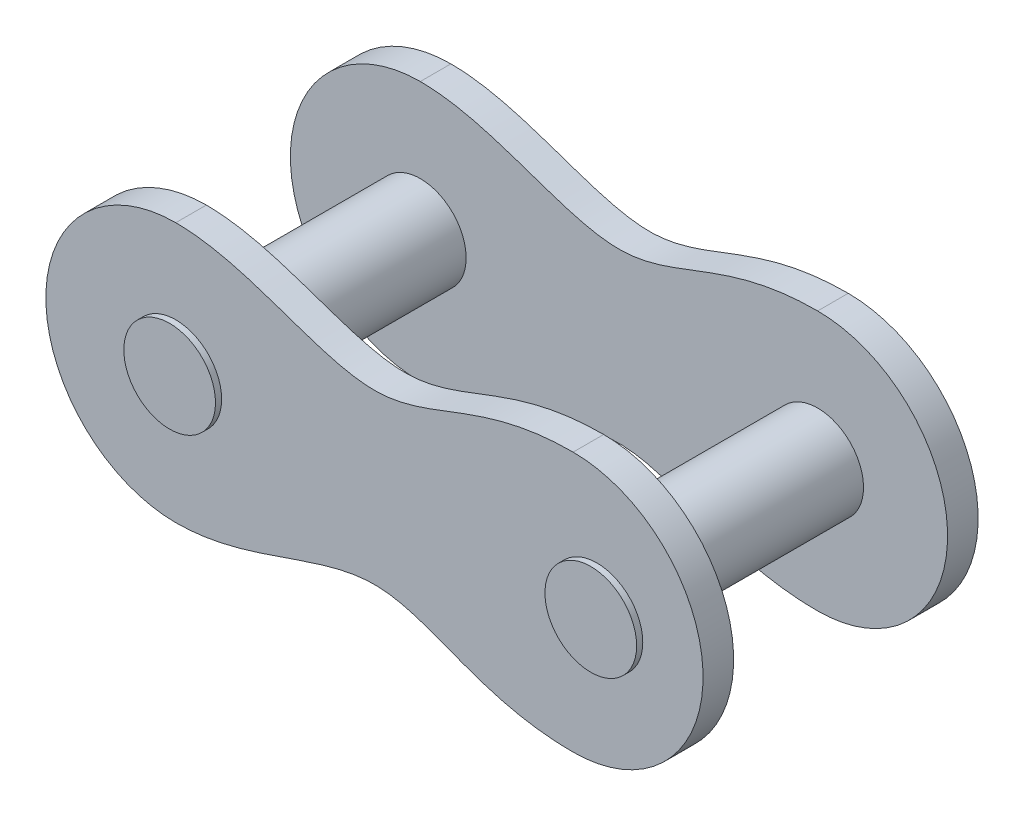
ISO-10303-21;
HEADER;
FILE_DESCRIPTION(('STEP AP214'),'2;1');
FILE_NAME('part.step','',(''),(''),'','','');
FILE_SCHEMA(('AUTOMOTIVE_DESIGN { 1 0 10303 214 1 1 1 1 }'));
ENDSEC;
DATA;
#1=APPLICATION_CONTEXT('core data for automotive mechanical design processes');
#2=APPLICATION_PROTOCOL_DEFINITION('international standard','automotive_design',2000,#1);
#3=PRODUCT_CONTEXT('',#1,'mechanical');
#4=PRODUCT('Part','Part','',(#3));
#5=PRODUCT_RELATED_PRODUCT_CATEGORY('part','',(#4));
#6=PRODUCT_DEFINITION_FORMATION('','',#4);
#7=PRODUCT_DEFINITION_CONTEXT('part definition',#1,'design');
#8=PRODUCT_DEFINITION('design','',#6,#7);
#9=PRODUCT_DEFINITION_SHAPE('','',#8);
#10=(LENGTH_UNIT() NAMED_UNIT(*) SI_UNIT(.MILLI.,.METRE.));
#11=(NAMED_UNIT(*) PLANE_ANGLE_UNIT() SI_UNIT($,.RADIAN.));
#12=(NAMED_UNIT(*) SI_UNIT($,.STERADIAN.) SOLID_ANGLE_UNIT());
#13=UNCERTAINTY_MEASURE_WITH_UNIT(LENGTH_MEASURE(1.E-05),#10,'distance_accuracy_value','');
#14=(GEOMETRIC_REPRESENTATION_CONTEXT(3) GLOBAL_UNCERTAINTY_ASSIGNED_CONTEXT((#13)) GLOBAL_UNIT_ASSIGNED_CONTEXT((#10,
#11,#12)) REPRESENTATION_CONTEXT('',''));
#15=CARTESIAN_POINT('',(0.,0.,0.));
#16=DIRECTION('',(0.,0.,1.));
#17=DIRECTION('',(1.,0.,0.));
#18=AXIS2_PLACEMENT_3D('',#15,#16,#17);
#19=CARTESIAN_POINT('',(0.,0.,9.));
#20=DIRECTION('',(0.,0.,-1.));
#21=DIRECTION('',(-1.,0.,0.));
#22=AXIS2_PLACEMENT_3D('',#19,#20,#21);
#23=CYLINDRICAL_SURFACE('',#22,1.5);
#24=CARTESIAN_POINT('',(0.,0.,2.));
#25=DIRECTION('',(0.,0.,1.));
#26=DIRECTION('',(0.,-1.,0.));
#27=AXIS2_PLACEMENT_3D('',#24,#25,#26);
#28=CIRCLE('',#27,1.5);
#29=CARTESIAN_POINT('',(0.,-1.5,2.));
#30=VERTEX_POINT('',#29);
#31=EDGE_CURVE('E122',#30,#30,#28,.T.);
#32=ORIENTED_EDGE('',*,*,#31,.T.);
#33=EDGE_LOOP('',(#32));
#34=FACE_BOUND('',#33,.T.);
#35=CARTESIAN_POINT('',(0.,0.,9.));
#36=DIRECTION('',(0.,0.,1.));
#37=DIRECTION('',(1.,0.,0.));
#38=AXIS2_PLACEMENT_3D('',#35,#36,#37);
#39=CIRCLE('',#38,1.5);
#40=CARTESIAN_POINT('',(1.5,0.,9.));
#41=VERTEX_POINT('',#40);
#42=EDGE_CURVE('E237',#41,#41,#39,.T.);
#43=ORIENTED_EDGE('',*,*,#42,.F.);
#44=EDGE_LOOP('',(#43));
#45=FACE_BOUND('',#44,.T.);
#46=ADVANCED_FACE('F36',(#34,#45),#23,.T.);
#47=CARTESIAN_POINT('',(13.,4.25,10.));
#48=CARTESIAN_POINT('',(9.8864097179551,4.25,10.));
#49=CARTESIAN_POINT('',(6.86364338574942,1.25,10.));
#50=CARTESIAN_POINT('',(2.38630351054606,4.25,10.));
#51=CARTESIAN_POINT('',(0.,4.25,10.));
#52=B_SPLINE_CURVE_WITH_KNOTS('',3,(#47,#48,#49,#50,#51),.UNSPECIFIED.,.F.,.F.,(4,1,4),(0.,0.5,
1.),.UNSPECIFIED.);
#53=DIRECTION('',(0.,0.,-1.));
#54=VECTOR('',#53,1.);
#55=SURFACE_OF_LINEAR_EXTRUSION('',#52,#54);
#56=CARTESIAN_POINT('',(13.,4.25,9.));
#57=CARTESIAN_POINT('',(9.8864097179551,4.25,9.));
#58=CARTESIAN_POINT('',(6.86364338574942,1.25,9.));
#59=CARTESIAN_POINT('',(2.38630351054606,4.25,9.));
#60=CARTESIAN_POINT('',(0.,4.25,9.));
#61=B_SPLINE_CURVE_WITH_KNOTS('',3,(#56,#57,#58,#59,#60),.UNSPECIFIED.,.F.,.F.,(4,1,4),(0.,0.5,
1.),.UNSPECIFIED.);
#62=CARTESIAN_POINT('',(13.,4.25,9.));
#63=VERTEX_POINT('',#62);
#64=CARTESIAN_POINT('',(0.,4.25,9.));
#65=VERTEX_POINT('',#64);
#66=EDGE_CURVE('E211',#63,#65,#61,.T.);
#67=ORIENTED_EDGE('',*,*,#66,.T.);
#68=DIRECTION('',(0.,0.,-1.));
#69=VECTOR('',#68,1.);
#70=CARTESIAN_POINT('',(0.,4.25,10.));
#71=LINE('',#70,#69);
#72=CARTESIAN_POINT('',(0.,4.25,10.));
#73=VERTEX_POINT('',#72);
#74=EDGE_CURVE('E235',#73,#65,#71,.T.);
#75=ORIENTED_EDGE('',*,*,#74,.F.);
#76=CARTESIAN_POINT('',(13.,4.25,10.));
#77=VERTEX_POINT('',#76);
#78=EDGE_CURVE('E229',#77,#73,#52,.T.);
#79=ORIENTED_EDGE('',*,*,#78,.F.);
#80=DIRECTION('',(0.,0.,-1.));
#81=VECTOR('',#80,1.);
#82=CARTESIAN_POINT('',(13.,4.25,10.));
#83=LINE('',#82,#81);
#84=EDGE_CURVE('E210',#77,#63,#83,.T.);
#85=ORIENTED_EDGE('',*,*,#84,.T.);
#86=EDGE_LOOP('',(#67,#75,#79,#85));
#87=FACE_BOUND('',#86,.T.);
#88=ADVANCED_FACE('F264',(#87),#55,.F.);
#89=CARTESIAN_POINT('',(0.,0.,10.));
#90=DIRECTION('',(0.,0.,-1.));
#91=DIRECTION('',(-1.,0.,0.));
#92=AXIS2_PLACEMENT_3D('',#89,#90,#91);
#93=CYLINDRICAL_SURFACE('',#92,4.25);
#94=CARTESIAN_POINT('',(0.,0.,9.));
#95=DIRECTION('',(0.,0.,1.));
#96=DIRECTION('',(1.,0.,0.));
#97=AXIS2_PLACEMENT_3D('',#94,#95,#96);
#98=CIRCLE('',#97,4.25);
#99=CARTESIAN_POINT('',(0.,-4.25,9.));
#100=VERTEX_POINT('',#99);
#101=EDGE_CURVE('E216',#65,#100,#98,.T.);
#102=ORIENTED_EDGE('',*,*,#101,.T.);
#103=DIRECTION('',(0.,0.,-1.));
#104=VECTOR('',#103,1.);
#105=CARTESIAN_POINT('',(0.,-4.25,10.));
#106=LINE('',#105,#104);
#107=CARTESIAN_POINT('',(0.,-4.25,10.));
#108=VERTEX_POINT('',#107);
#109=EDGE_CURVE('E233',#108,#100,#106,.T.);
#110=ORIENTED_EDGE('',*,*,#109,.F.);
#111=CARTESIAN_POINT('',(0.,0.,10.));
#112=DIRECTION('',(0.,0.,1.));
#113=DIRECTION('',(1.,0.,0.));
#114=AXIS2_PLACEMENT_3D('',#111,#112,#113);
#115=CIRCLE('',#114,4.25);
#116=EDGE_CURVE('E84',#73,#108,#115,.T.);
#117=ORIENTED_EDGE('',*,*,#116,.F.);
#118=ORIENTED_EDGE('',*,*,#74,.T.);
#119=EDGE_LOOP('',(#102,#110,#117,#118));
#120=FACE_BOUND('',#119,.T.);
#121=ADVANCED_FACE('F198',(#120),#93,.T.);
#122=CARTESIAN_POINT('',(0.,-4.25,10.));
#123=CARTESIAN_POINT('',(2.38630351054606,-4.25,10.));
#124=CARTESIAN_POINT('',(6.86364338574942,-1.25,10.));
#125=CARTESIAN_POINT('',(9.8864097179551,-4.25,10.));
#126=CARTESIAN_POINT('',(13.,-4.25,10.));
#127=B_SPLINE_CURVE_WITH_KNOTS('',3,(#122,#123,#124,#125,#126),.UNSPECIFIED.,.F.,.F.,(4,1,4),
(0.,0.5,1.),.UNSPECIFIED.);
#128=DIRECTION('',(0.,0.,-1.));
#129=VECTOR('',#128,1.);
#130=SURFACE_OF_LINEAR_EXTRUSION('',#127,#129);
#131=CARTESIAN_POINT('',(0.,-4.25,9.));
#132=CARTESIAN_POINT('',(2.38630351054606,-4.25,9.));
#133=CARTESIAN_POINT('',(6.86364338574942,-1.25,9.));
#134=CARTESIAN_POINT('',(9.8864097179551,-4.25,9.));
#135=CARTESIAN_POINT('',(13.,-4.25,9.));
#136=B_SPLINE_CURVE_WITH_KNOTS('',3,(#131,#132,#133,#134,#135),.UNSPECIFIED.,.F.,.F.,(4,1,4),
(0.,0.5,1.),.UNSPECIFIED.);
#137=CARTESIAN_POINT('',(13.,-4.25,9.));
#138=VERTEX_POINT('',#137);
#139=EDGE_CURVE('E70',#100,#138,#136,.T.);
#140=ORIENTED_EDGE('',*,*,#139,.T.);
#141=DIRECTION('',(0.,0.,-1.));
#142=VECTOR('',#141,1.);
#143=CARTESIAN_POINT('',(13.,-4.25,10.));
#144=LINE('',#143,#142);
#145=CARTESIAN_POINT('',(13.,-4.25,10.));
#146=VERTEX_POINT('',#145);
#147=EDGE_CURVE('E231',#146,#138,#144,.T.);
#148=ORIENTED_EDGE('',*,*,#147,.F.);
#149=EDGE_CURVE('E199',#108,#146,#127,.T.);
#150=ORIENTED_EDGE('',*,*,#149,.F.);
#151=ORIENTED_EDGE('',*,*,#109,.T.);
#152=EDGE_LOOP('',(#140,#148,#150,#151));
#153=FACE_BOUND('',#152,.T.);
#154=ADVANCED_FACE('F194',(#153),#130,.F.);
#155=CARTESIAN_POINT('',(13.,0.,10.));
#156=DIRECTION('',(0.,0.,-1.));
#157=DIRECTION('',(-1.,0.,0.));
#158=AXIS2_PLACEMENT_3D('',#155,#156,#157);
#159=CYLINDRICAL_SURFACE('',#158,4.25);
#160=CARTESIAN_POINT('',(13.,0.,9.));
#161=DIRECTION('',(0.,0.,1.));
#162=DIRECTION('',(1.,0.,0.));
#163=AXIS2_PLACEMENT_3D('',#160,#161,#162);
#164=CIRCLE('',#163,4.25);
#165=EDGE_CURVE('E76',#138,#63,#164,.T.);
#166=ORIENTED_EDGE('',*,*,#165,.T.);
#167=ORIENTED_EDGE('',*,*,#84,.F.);
#168=CARTESIAN_POINT('',(13.,0.,10.));
#169=DIRECTION('',(0.,0.,1.));
#170=DIRECTION('',(1.,0.,0.));
#171=AXIS2_PLACEMENT_3D('',#168,#169,#170);
#172=CIRCLE('',#171,4.25);
#173=EDGE_CURVE('E52',#146,#77,#172,.T.);
#174=ORIENTED_EDGE('',*,*,#173,.F.);
#175=ORIENTED_EDGE('',*,*,#147,.T.);
#176=EDGE_LOOP('',(#166,#167,#174,#175));
#177=FACE_BOUND('',#176,.T.);
#178=ADVANCED_FACE('F187',(#177),#159,.T.);
#179=CARTESIAN_POINT('',(6.5,2.75,10.));
#180=DIRECTION('',(0.,0.,1.));
#181=DIRECTION('',(1.,0.,0.));
#182=AXIS2_PLACEMENT_3D('',#179,#180,#181);
#183=PLANE('',#182);
#184=CARTESIAN_POINT('',(13.7777182461689,0.,10.));
#185=DIRECTION('',(0.,0.,1.));
#186=DIRECTION('',(1.,0.,0.));
#187=AXIS2_PLACEMENT_3D('',#184,#185,#186);
#188=CIRCLE('',#187,1.5);
#189=CARTESIAN_POINT('',(15.2777182461689,0.,10.));
#190=VERTEX_POINT('',#189);
#191=EDGE_CURVE('E245',#190,#190,#188,.T.);
#192=ORIENTED_EDGE('',*,*,#191,.F.);
#193=EDGE_LOOP('',(#192));
#194=FACE_BOUND('',#193,.T.);
#195=CARTESIAN_POINT('',(0.,0.,10.));
#196=DIRECTION('',(0.,0.,1.));
#197=DIRECTION('',(1.,0.,0.));
#198=AXIS2_PLACEMENT_3D('',#195,#196,#197);
#199=CIRCLE('',#198,1.5);
#200=CARTESIAN_POINT('',(1.5,0.,10.));
#201=VERTEX_POINT('',#200);
#202=EDGE_CURVE('E425',#201,#201,#199,.T.);
#203=ORIENTED_EDGE('',*,*,#202,.F.);
#204=EDGE_LOOP('',(#203));
#205=FACE_BOUND('',#204,.T.);
#206=ORIENTED_EDGE('',*,*,#78,.T.);
#207=ORIENTED_EDGE('',*,*,#116,.T.);
#208=ORIENTED_EDGE('',*,*,#149,.T.);
#209=ORIENTED_EDGE('',*,*,#173,.T.);
#210=EDGE_LOOP('',(#206,#207,#208,#209));
#211=FACE_BOUND('',#210,.T.);
#212=ADVANCED_FACE('F184',(#194,#205,#211),#183,.T.);
#213=CARTESIAN_POINT('',(6.5,2.75,9.));
#214=DIRECTION('',(0.,0.,1.));
#215=DIRECTION('',(1.,0.,0.));
#216=AXIS2_PLACEMENT_3D('',#213,#214,#215);
#217=PLANE('',#216);
#218=CARTESIAN_POINT('',(13.,0.,9.));
#219=DIRECTION('',(0.,0.,1.));
#220=DIRECTION('',(1.,0.,0.));
#221=AXIS2_PLACEMENT_3D('',#218,#219,#220);
#222=CIRCLE('',#221,1.5);
#223=CARTESIAN_POINT('',(14.5,0.,9.));
#224=VERTEX_POINT('',#223);
#225=EDGE_CURVE('E240',#224,#224,#222,.F.);
#226=ORIENTED_EDGE('',*,*,#225,.F.);
#227=EDGE_LOOP('',(#226));
#228=FACE_BOUND('',#227,.T.);
#229=ORIENTED_EDGE('',*,*,#42,.T.);
#230=EDGE_LOOP('',(#229));
#231=FACE_BOUND('',#230,.T.);
#232=ORIENTED_EDGE('',*,*,#66,.F.);
#233=ORIENTED_EDGE('',*,*,#165,.F.);
#234=ORIENTED_EDGE('',*,*,#139,.F.);
#235=ORIENTED_EDGE('',*,*,#101,.F.);
#236=EDGE_LOOP('',(#232,#233,#234,#235));
#237=FACE_BOUND('',#236,.T.);
#238=ADVANCED_FACE('F182',(#228,#231,#237),#217,.F.);
#239=CARTESIAN_POINT('',(13.,0.,9.));
#240=DIRECTION('',(0.,0.,-1.));
#241=DIRECTION('',(-1.,0.,0.));
#242=AXIS2_PLACEMENT_3D('',#239,#240,#241);
#243=CYLINDRICAL_SURFACE('',#242,1.5);
#244=CARTESIAN_POINT('',(13.,0.,2.));
#245=DIRECTION('',(0.,0.,1.));
#246=DIRECTION('',(0.,-1.,0.));
#247=AXIS2_PLACEMENT_3D('',#244,#245,#246);
#248=CIRCLE('',#247,1.5);
#249=CARTESIAN_POINT('',(13.,-1.5,2.));
#250=VERTEX_POINT('',#249);
#251=EDGE_CURVE('E243',#250,#250,#248,.T.);
#252=ORIENTED_EDGE('',*,*,#251,.T.);
#253=EDGE_LOOP('',(#252));
#254=FACE_BOUND('',#253,.T.);
#255=ORIENTED_EDGE('',*,*,#225,.T.);
#256=EDGE_LOOP('',(#255));
#257=FACE_BOUND('',#256,.T.);
#258=ADVANCED_FACE('F178',(#254,#257),#243,.T.);
#259=CARTESIAN_POINT('',(0.,0.,10.2));
#260=DIRECTION('',(0.,0.,-1.));
#261=DIRECTION('',(-1.,0.,0.));
#262=AXIS2_PLACEMENT_3D('',#259,#260,#261);
#263=CYLINDRICAL_SURFACE('',#262,1.5);
#264=CARTESIAN_POINT('',(0.,0.,10.2));
#265=DIRECTION('',(0.,0.,1.));
#266=DIRECTION('',(1.,0.,0.));
#267=AXIS2_PLACEMENT_3D('',#264,#265,#266);
#268=CIRCLE('',#267,1.5);
#269=CARTESIAN_POINT('',(1.5,0.,10.2));
#270=VERTEX_POINT('',#269);
#271=EDGE_CURVE('E217',#270,#270,#268,.T.);
#272=ORIENTED_EDGE('',*,*,#271,.F.);
#273=EDGE_LOOP('',(#272));
#274=FACE_BOUND('',#273,.T.);
#275=ORIENTED_EDGE('',*,*,#202,.T.);
#276=EDGE_LOOP('',(#275));
#277=FACE_BOUND('',#276,.T.);
#278=ADVANCED_FACE('F174',(#274,#277),#263,.T.);
#279=CARTESIAN_POINT('',(0.,0.,10.2));
#280=DIRECTION('',(0.,0.,1.));
#281=DIRECTION('',(1.,0.,0.));
#282=AXIS2_PLACEMENT_3D('',#279,#280,#281);
#283=PLANE('',#282);
#284=ORIENTED_EDGE('',*,*,#271,.T.);
#285=EDGE_LOOP('',(#284));
#286=FACE_BOUND('',#285,.T.);
#287=ADVANCED_FACE('F170',(#286),#283,.T.);
#288=CARTESIAN_POINT('',(13.7777182461689,0.,10.2));
#289=DIRECTION('',(0.,0.,-1.));
#290=DIRECTION('',(-1.,0.,0.));
#291=AXIS2_PLACEMENT_3D('',#288,#289,#290);
#292=CYLINDRICAL_SURFACE('',#291,1.5);
#293=CARTESIAN_POINT('',(13.7777182461689,0.,10.2));
#294=DIRECTION('',(0.,0.,1.));
#295=DIRECTION('',(1.,0.,0.));
#296=AXIS2_PLACEMENT_3D('',#293,#294,#295);
#297=CIRCLE('',#296,1.5);
#298=CARTESIAN_POINT('',(15.2777182461689,0.,10.2));
#299=VERTEX_POINT('',#298);
#300=EDGE_CURVE('E422',#299,#299,#297,.T.);
#301=ORIENTED_EDGE('',*,*,#300,.F.);
#302=EDGE_LOOP('',(#301));
#303=FACE_BOUND('',#302,.T.);
#304=ORIENTED_EDGE('',*,*,#191,.T.);
#305=EDGE_LOOP('',(#304));
#306=FACE_BOUND('',#305,.T.);
#307=ADVANCED_FACE('F166',(#303,#306),#292,.T.);
#308=CARTESIAN_POINT('',(13.7777182461689,0.,10.2));
#309=DIRECTION('',(0.,0.,1.));
#310=DIRECTION('',(1.,0.,0.));
#311=AXIS2_PLACEMENT_3D('',#308,#309,#310);
#312=PLANE('',#311);
#313=ORIENTED_EDGE('',*,*,#300,.T.);
#314=EDGE_LOOP('',(#313));
#315=FACE_BOUND('',#314,.T.);
#316=ADVANCED_FACE('F163',(#315),#312,.T.);
#317=CARTESIAN_POINT('',(13.,4.25,1.));
#318=CARTESIAN_POINT('',(9.8864097179551,4.25,1.));
#319=CARTESIAN_POINT('',(6.86364338574942,1.25,1.));
#320=CARTESIAN_POINT('',(2.38630351054606,4.25,1.));
#321=CARTESIAN_POINT('',(0.,4.25,1.));
#322=B_SPLINE_CURVE_WITH_KNOTS('',3,(#317,#318,#319,#320,#321),.UNSPECIFIED.,.F.,.F.,(4,1,4),
(0.,0.5,1.),.UNSPECIFIED.);
#323=DIRECTION('',(0.,0.,1.));
#324=VECTOR('',#323,1.);
#325=SURFACE_OF_LINEAR_EXTRUSION('',#322,#324);
#326=CARTESIAN_POINT('',(13.,4.25,2.));
#327=CARTESIAN_POINT('',(9.8864097179551,4.25,2.));
#328=CARTESIAN_POINT('',(6.86364338574942,1.25,2.));
#329=CARTESIAN_POINT('',(2.38630351054606,4.25,2.));
#330=CARTESIAN_POINT('',(0.,4.25,2.));
#331=B_SPLINE_CURVE_WITH_KNOTS('',3,(#326,#327,#328,#329,#330),.UNSPECIFIED.,.F.,.F.,(4,1,4),
(0.,0.5,1.),.UNSPECIFIED.);
#332=CARTESIAN_POINT('',(13.,4.25,2.));
#333=VERTEX_POINT('',#332);
#334=CARTESIAN_POINT('',(0.,4.25,2.));
#335=VERTEX_POINT('',#334);
#336=EDGE_CURVE('E117',#333,#335,#331,.T.);
#337=ORIENTED_EDGE('',*,*,#336,.F.);
#338=DIRECTION('',(0.,0.,1.));
#339=VECTOR('',#338,1.);
#340=CARTESIAN_POINT('',(13.,4.25,1.));
#341=LINE('',#340,#339);
#342=CARTESIAN_POINT('',(13.,4.25,1.));
#343=VERTEX_POINT('',#342);
#344=EDGE_CURVE('E111',#343,#333,#341,.T.);
#345=ORIENTED_EDGE('',*,*,#344,.F.);
#346=CARTESIAN_POINT('',(0.,4.25,1.));
#347=VERTEX_POINT('',#346);
#348=EDGE_CURVE('E114',#343,#347,#322,.T.);
#349=ORIENTED_EDGE('',*,*,#348,.T.);
#350=DIRECTION('',(0.,0.,1.));
#351=VECTOR('',#350,1.);
#352=CARTESIAN_POINT('',(0.,4.25,1.));
#353=LINE('',#352,#351);
#354=EDGE_CURVE('E416',#347,#335,#353,.T.);
#355=ORIENTED_EDGE('',*,*,#354,.T.);
#356=EDGE_LOOP('',(#337,#345,#349,#355));
#357=FACE_BOUND('',#356,.T.);
#358=ADVANCED_FACE('F113',(#357),#325,.T.);
#359=CARTESIAN_POINT('',(13.,0.,1.));
#360=DIRECTION('',(0.,0.,1.));
#361=DIRECTION('',(0.,-1.,0.));
#362=AXIS2_PLACEMENT_3D('',#359,#360,#361);
#363=CYLINDRICAL_SURFACE('',#362,4.25);
#364=CARTESIAN_POINT('',(13.,0.,2.));
#365=DIRECTION('',(0.,0.,1.));
#366=DIRECTION('',(1.,0.,0.));
#367=AXIS2_PLACEMENT_3D('',#364,#365,#366);
#368=CIRCLE('',#367,4.25);
#369=CARTESIAN_POINT('',(13.,-4.25,2.));
#370=VERTEX_POINT('',#369);
#371=EDGE_CURVE('E396',#370,#333,#368,.T.);
#372=ORIENTED_EDGE('',*,*,#371,.F.);
#373=DIRECTION('',(0.,0.,1.));
#374=VECTOR('',#373,1.);
#375=CARTESIAN_POINT('',(13.,-4.25,1.));
#376=LINE('',#375,#374);
#377=CARTESIAN_POINT('',(13.,-4.25,1.));
#378=VERTEX_POINT('',#377);
#379=EDGE_CURVE('E123',#378,#370,#376,.T.);
#380=ORIENTED_EDGE('',*,*,#379,.F.);
#381=CARTESIAN_POINT('',(13.,0.,1.));
#382=DIRECTION('',(0.,0.,1.));
#383=DIRECTION('',(1.,0.,0.));
#384=AXIS2_PLACEMENT_3D('',#381,#382,#383);
#385=CIRCLE('',#384,4.25);
#386=EDGE_CURVE('E129',#378,#343,#385,.T.);
#387=ORIENTED_EDGE('',*,*,#386,.T.);
#388=ORIENTED_EDGE('',*,*,#344,.T.);
#389=EDGE_LOOP('',(#372,#380,#387,#388));
#390=FACE_BOUND('',#389,.T.);
#391=ADVANCED_FACE('F135',(#390),#363,.T.);
#392=CARTESIAN_POINT('',(0.,-4.25,1.));
#393=CARTESIAN_POINT('',(2.38630351054606,-4.25,1.));
#394=CARTESIAN_POINT('',(6.86364338574942,-1.25,1.));
#395=CARTESIAN_POINT('',(9.8864097179551,-4.25,1.));
#396=CARTESIAN_POINT('',(13.,-4.25,1.));
#397=B_SPLINE_CURVE_WITH_KNOTS('',3,(#392,#393,#394,#395,#396),.UNSPECIFIED.,.F.,.F.,(4,1,4),
(0.,0.5,1.),.UNSPECIFIED.);
#398=DIRECTION('',(0.,0.,1.));
#399=VECTOR('',#398,1.);
#400=SURFACE_OF_LINEAR_EXTRUSION('',#397,#399);
#401=CARTESIAN_POINT('',(0.,-4.25,2.));
#402=CARTESIAN_POINT('',(2.38630351054606,-4.25,2.));
#403=CARTESIAN_POINT('',(6.86364338574942,-1.25,2.));
#404=CARTESIAN_POINT('',(9.8864097179551,-4.25,2.));
#405=CARTESIAN_POINT('',(13.,-4.25,2.));
#406=B_SPLINE_CURVE_WITH_KNOTS('',3,(#401,#402,#403,#404,#405),.UNSPECIFIED.,.F.,.F.,(4,1,4),
(0.,0.5,1.),.UNSPECIFIED.);
#407=CARTESIAN_POINT('',(0.,-4.25,2.));
#408=VERTEX_POINT('',#407);
#409=EDGE_CURVE('E400',#408,#370,#406,.T.);
#410=ORIENTED_EDGE('',*,*,#409,.F.);
#411=DIRECTION('',(0.,0.,1.));
#412=VECTOR('',#411,1.);
#413=CARTESIAN_POINT('',(0.,-4.25,1.));
#414=LINE('',#413,#412);
#415=CARTESIAN_POINT('',(0.,-4.25,1.));
#416=VERTEX_POINT('',#415);
#417=EDGE_CURVE('E418',#416,#408,#414,.T.);
#418=ORIENTED_EDGE('',*,*,#417,.F.);
#419=EDGE_CURVE('E136',#416,#378,#397,.T.);
#420=ORIENTED_EDGE('',*,*,#419,.T.);
#421=ORIENTED_EDGE('',*,*,#379,.T.);
#422=EDGE_LOOP('',(#410,#418,#420,#421));
#423=FACE_BOUND('',#422,.T.);
#424=ADVANCED_FACE('F152',(#423),#400,.T.);
#425=CARTESIAN_POINT('',(0.,0.,1.));
#426=DIRECTION('',(0.,0.,1.));
#427=DIRECTION('',(0.,-1.,0.));
#428=AXIS2_PLACEMENT_3D('',#425,#426,#427);
#429=CYLINDRICAL_SURFACE('',#428,4.25);
#430=CARTESIAN_POINT('',(0.,0.,2.));
#431=DIRECTION('',(0.,0.,1.));
#432=DIRECTION('',(1.,0.,0.));
#433=AXIS2_PLACEMENT_3D('',#430,#431,#432);
#434=CIRCLE('',#433,4.25);
#435=EDGE_CURVE('E133',#335,#408,#434,.T.);
#436=ORIENTED_EDGE('',*,*,#435,.F.);
#437=ORIENTED_EDGE('',*,*,#354,.F.);
#438=CARTESIAN_POINT('',(0.,0.,1.));
#439=DIRECTION('',(0.,0.,1.));
#440=DIRECTION('',(1.,0.,0.));
#441=AXIS2_PLACEMENT_3D('',#438,#439,#440);
#442=CIRCLE('',#441,4.25);
#443=EDGE_CURVE('E132',#347,#416,#442,.T.);
#444=ORIENTED_EDGE('',*,*,#443,.T.);
#445=ORIENTED_EDGE('',*,*,#417,.T.);
#446=EDGE_LOOP('',(#436,#437,#444,#445));
#447=FACE_BOUND('',#446,.T.);
#448=ADVANCED_FACE('F156',(#447),#429,.T.);
#449=CARTESIAN_POINT('',(6.5,2.75,1.));
#450=DIRECTION('',(0.,0.,-1.));
#451=DIRECTION('',(1.,0.,0.));
#452=AXIS2_PLACEMENT_3D('',#449,#450,#451);
#453=PLANE('',#452);
#454=CARTESIAN_POINT('',(13.7777182461689,0.,1.));
#455=DIRECTION('',(0.,0.,-1.));
#456=DIRECTION('',(0.,1.,0.));
#457=AXIS2_PLACEMENT_3D('',#454,#455,#456);
#458=CIRCLE('',#457,1.5);
#459=CARTESIAN_POINT('',(13.7777182461689,1.5,1.));
#460=VERTEX_POINT('',#459);
#461=EDGE_CURVE('E11',#460,#460,#458,.T.);
#462=ORIENTED_EDGE('',*,*,#461,.F.);
#463=EDGE_LOOP('',(#462));
#464=FACE_BOUND('',#463,.T.);
#465=CARTESIAN_POINT('',(0.,0.,1.));
#466=DIRECTION('',(0.,0.,-1.));
#467=DIRECTION('',(0.,1.,0.));
#468=AXIS2_PLACEMENT_3D('',#465,#466,#467);
#469=CIRCLE('',#468,1.5);
#470=CARTESIAN_POINT('',(0.,1.5,1.));
#471=VERTEX_POINT('',#470);
#472=EDGE_CURVE('E44',#471,#471,#469,.T.);
#473=ORIENTED_EDGE('',*,*,#472,.F.);
#474=EDGE_LOOP('',(#473));
#475=FACE_BOUND('',#474,.T.);
#476=ORIENTED_EDGE('',*,*,#348,.F.);
#477=ORIENTED_EDGE('',*,*,#386,.F.);
#478=ORIENTED_EDGE('',*,*,#419,.F.);
#479=ORIENTED_EDGE('',*,*,#443,.F.);
#480=EDGE_LOOP('',(#476,#477,#478,#479));
#481=FACE_BOUND('',#480,.T.);
#482=ADVANCED_FACE('F127',(#464,#475,#481),#453,.T.);
#483=CARTESIAN_POINT('',(6.5,2.75,2.));
#484=DIRECTION('',(0.,0.,-1.));
#485=DIRECTION('',(1.,0.,0.));
#486=AXIS2_PLACEMENT_3D('',#483,#484,#485);
#487=PLANE('',#486);
#488=ORIENTED_EDGE('',*,*,#251,.F.);
#489=EDGE_LOOP('',(#488));
#490=FACE_BOUND('',#489,.T.);
#491=ORIENTED_EDGE('',*,*,#31,.F.);
#492=EDGE_LOOP('',(#491));
#493=FACE_BOUND('',#492,.T.);
#494=ORIENTED_EDGE('',*,*,#336,.T.);
#495=ORIENTED_EDGE('',*,*,#435,.T.);
#496=ORIENTED_EDGE('',*,*,#409,.T.);
#497=ORIENTED_EDGE('',*,*,#371,.T.);
#498=EDGE_LOOP('',(#494,#495,#496,#497));
#499=FACE_BOUND('',#498,.T.);
#500=ADVANCED_FACE('F252',(#490,#493,#499),#487,.F.);
#501=CARTESIAN_POINT('',(0.,0.,0.800000000000001));
#502=DIRECTION('',(0.,0.,1.));
#503=DIRECTION('',(0.,-1.,0.));
#504=AXIS2_PLACEMENT_3D('',#501,#502,#503);
#505=CYLINDRICAL_SURFACE('',#504,1.5);
#506=CARTESIAN_POINT('',(0.,0.,0.800000000000001));
#507=DIRECTION('',(0.,0.,1.));
#508=DIRECTION('',(1.,0.,0.));
#509=AXIS2_PLACEMENT_3D('',#506,#507,#508);
#510=CIRCLE('',#509,1.5);
#511=CARTESIAN_POINT('',(1.5,0.,0.800000000000001));
#512=VERTEX_POINT('',#511);
#513=EDGE_CURVE('E392',#512,#512,#510,.T.);
#514=ORIENTED_EDGE('',*,*,#513,.T.);
#515=EDGE_LOOP('',(#514));
#516=FACE_BOUND('',#515,.T.);
#517=ORIENTED_EDGE('',*,*,#472,.T.);
#518=EDGE_LOOP('',(#517));
#519=FACE_BOUND('',#518,.T.);
#520=ADVANCED_FACE('F249',(#516,#519),#505,.T.);
#521=CARTESIAN_POINT('',(0.,0.,0.800000000000001));
#522=DIRECTION('',(0.,0.,-1.));
#523=DIRECTION('',(1.,0.,0.));
#524=AXIS2_PLACEMENT_3D('',#521,#522,#523);
#525=PLANE('',#524);
#526=ORIENTED_EDGE('',*,*,#513,.F.);
#527=EDGE_LOOP('',(#526));
#528=FACE_BOUND('',#527,.T.);
#529=ADVANCED_FACE('F356',(#528),#525,.T.);
#530=CARTESIAN_POINT('',(13.7777182461689,0.,0.800000000000001));
#531=DIRECTION('',(0.,0.,1.));
#532=DIRECTION('',(0.,-1.,0.));
#533=AXIS2_PLACEMENT_3D('',#530,#531,#532);
#534=CYLINDRICAL_SURFACE('',#533,1.5);
#535=CARTESIAN_POINT('',(13.7777182461689,0.,0.800000000000001));
#536=DIRECTION('',(0.,0.,1.));
#537=DIRECTION('',(1.,0.,0.));
#538=AXIS2_PLACEMENT_3D('',#535,#536,#537);
#539=CIRCLE('',#538,1.5);
#540=CARTESIAN_POINT('',(15.2777182461689,0.,0.800000000000001));
#541=VERTEX_POINT('',#540);
#542=EDGE_CURVE('E391',#541,#541,#539,.T.);
#543=ORIENTED_EDGE('',*,*,#542,.T.);
#544=EDGE_LOOP('',(#543));
#545=FACE_BOUND('',#544,.T.);
#546=ORIENTED_EDGE('',*,*,#461,.T.);
#547=EDGE_LOOP('',(#546));
#548=FACE_BOUND('',#547,.T.);
#549=ADVANCED_FACE('F365',(#545,#548),#534,.T.);
#550=CARTESIAN_POINT('',(13.7777182461689,0.,0.800000000000001));
#551=DIRECTION('',(0.,0.,-1.));
#552=DIRECTION('',(1.,0.,0.));
#553=AXIS2_PLACEMENT_3D('',#550,#551,#552);
#554=PLANE('',#553);
#555=ORIENTED_EDGE('',*,*,#542,.F.);
#556=EDGE_LOOP('',(#555));
#557=FACE_BOUND('',#556,.T.);
#558=ADVANCED_FACE('F375',(#557),#554,.T.);
#559=CLOSED_SHELL('',(#46,#88,#121,#154,#178,#212,#238,#258,#278,#287,#307,#316,#358,#391,#424,
#448,#482,#500,#520,#529,#549,#558));
#560=MANIFOLD_SOLID_BREP('B2',#559);
#561=ADVANCED_BREP_SHAPE_REPRESENTATION('',(#18,#560),#14);
#562=SHAPE_DEFINITION_REPRESENTATION(#9,#561);
ENDSEC;
END-ISO-10303-21;
